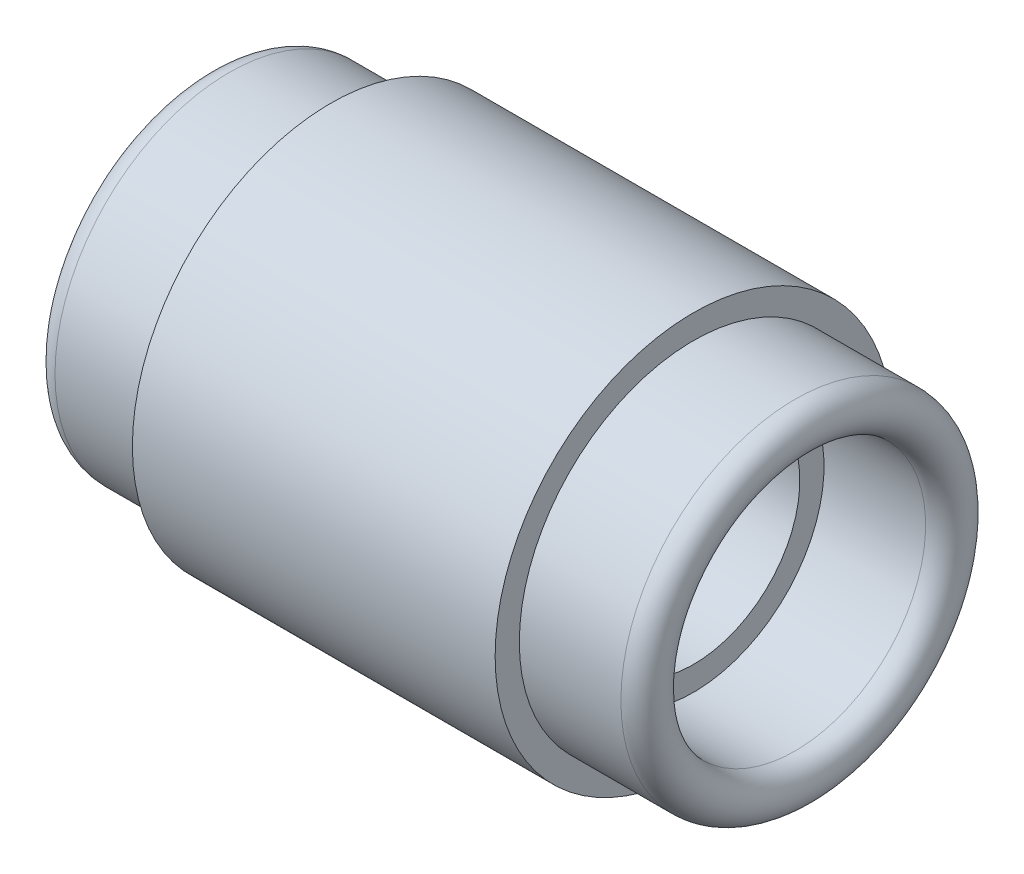
ISO-10303-21;
HEADER;
FILE_DESCRIPTION(('STEP AP214'),'2;1');
FILE_NAME('part.step','',(''),(''),'','','');
FILE_SCHEMA(('AUTOMOTIVE_DESIGN { 1 0 10303 214 1 1 1 1 }'));
ENDSEC;
DATA;
#1=APPLICATION_CONTEXT('core data for automotive mechanical design processes');
#2=APPLICATION_PROTOCOL_DEFINITION('international standard','automotive_design',2000,#1);
#3=PRODUCT_CONTEXT('',#1,'mechanical');
#4=PRODUCT('Part','Part','',(#3));
#5=PRODUCT_RELATED_PRODUCT_CATEGORY('part','',(#4));
#6=PRODUCT_DEFINITION_FORMATION('','',#4);
#7=PRODUCT_DEFINITION_CONTEXT('part definition',#1,'design');
#8=PRODUCT_DEFINITION('design','',#6,#7);
#9=PRODUCT_DEFINITION_SHAPE('','',#8);
#10=(LENGTH_UNIT() NAMED_UNIT(*) SI_UNIT(.MILLI.,.METRE.));
#11=(NAMED_UNIT(*) PLANE_ANGLE_UNIT() SI_UNIT($,.RADIAN.));
#12=(NAMED_UNIT(*) SI_UNIT($,.STERADIAN.) SOLID_ANGLE_UNIT());
#13=UNCERTAINTY_MEASURE_WITH_UNIT(LENGTH_MEASURE(1.E-05),#10,'distance_accuracy_value','');
#14=(GEOMETRIC_REPRESENTATION_CONTEXT(3) GLOBAL_UNCERTAINTY_ASSIGNED_CONTEXT((#13)) GLOBAL_UNIT_ASSIGNED_CONTEXT((#10,
#11,#12)) REPRESENTATION_CONTEXT('',''));
#15=CARTESIAN_POINT('',(0.,0.,0.));
#16=DIRECTION('',(0.,0.,1.));
#17=DIRECTION('',(1.,0.,0.));
#18=AXIS2_PLACEMENT_3D('',#15,#16,#17);
#19=CARTESIAN_POINT('',(-37.5,36.,0.));
#20=DIRECTION('',(1.,0.,0.));
#21=DIRECTION('',(0.,0.,-1.));
#22=AXIS2_PLACEMENT_3D('',#19,#20,#21);
#23=PLANE('',#22);
#24=CARTESIAN_POINT('',(-37.5,0.,0.));
#25=DIRECTION('',(-1.,0.,0.));
#26=DIRECTION('',(0.,0.,1.));
#27=AXIS2_PLACEMENT_3D('',#24,#25,#26);
#28=CIRCLE('',#27,36.);
#29=CARTESIAN_POINT('',(-37.5,0.,36.));
#30=VERTEX_POINT('',#29);
#31=EDGE_CURVE('E54',#30,#30,#28,.T.);
#32=ORIENTED_EDGE('',*,*,#31,.F.);
#33=EDGE_LOOP('',(#32));
#34=FACE_BOUND('',#33,.T.);
#35=CARTESIAN_POINT('',(-37.5,0.,0.));
#36=DIRECTION('',(-1.,0.,0.));
#37=DIRECTION('',(0.,0.,1.));
#38=AXIS2_PLACEMENT_3D('',#35,#36,#37);
#39=CIRCLE('',#38,41.);
#40=CARTESIAN_POINT('',(-37.5,0.,41.));
#41=VERTEX_POINT('',#40);
#42=EDGE_CURVE('E10',#41,#41,#39,.T.);
#43=ORIENTED_EDGE('',*,*,#42,.T.);
#44=EDGE_LOOP('',(#43));
#45=FACE_BOUND('',#44,.T.);
#46=ADVANCED_FACE('F14',(#34,#45),#23,.F.);
#47=CARTESIAN_POINT('',(-110.,0.,0.));
#48=DIRECTION('',(-1.,0.,0.));
#49=DIRECTION('',(0.,0.,1.));
#50=AXIS2_PLACEMENT_3D('',#47,#48,#49);
#51=CYLINDRICAL_SURFACE('',#50,41.);
#52=ORIENTED_EDGE('',*,*,#42,.F.);
#53=EDGE_LOOP('',(#52));
#54=FACE_BOUND('',#53,.T.);
#55=CARTESIAN_POINT('',(37.5,0.,0.));
#56=DIRECTION('',(-1.,0.,0.));
#57=DIRECTION('',(0.,0.,1.));
#58=AXIS2_PLACEMENT_3D('',#55,#56,#57);
#59=CIRCLE('',#58,41.);
#60=CARTESIAN_POINT('',(37.5,0.,41.));
#61=VERTEX_POINT('',#60);
#62=EDGE_CURVE('E20',#61,#61,#59,.T.);
#63=ORIENTED_EDGE('',*,*,#62,.T.);
#64=EDGE_LOOP('',(#63));
#65=FACE_BOUND('',#64,.T.);
#66=ADVANCED_FACE('F61',(#54,#65),#51,.T.);
#67=CARTESIAN_POINT('',(37.5,36.,0.));
#68=DIRECTION('',(-1.,0.,0.));
#69=DIRECTION('',(0.,0.,1.));
#70=AXIS2_PLACEMENT_3D('',#67,#68,#69);
#71=PLANE('',#70);
#72=ORIENTED_EDGE('',*,*,#62,.F.);
#73=EDGE_LOOP('',(#72));
#74=FACE_BOUND('',#73,.T.);
#75=CARTESIAN_POINT('',(37.5,0.,0.));
#76=DIRECTION('',(-1.,0.,0.));
#77=DIRECTION('',(0.,0.,1.));
#78=AXIS2_PLACEMENT_3D('',#75,#76,#77);
#79=CIRCLE('',#78,36.);
#80=CARTESIAN_POINT('',(37.5,0.,36.));
#81=VERTEX_POINT('',#80);
#82=EDGE_CURVE('E24',#81,#81,#79,.T.);
#83=ORIENTED_EDGE('',*,*,#82,.T.);
#84=EDGE_LOOP('',(#83));
#85=FACE_BOUND('',#84,.T.);
#86=ADVANCED_FACE('F66',(#74,#85),#71,.F.);
#87=CARTESIAN_POINT('',(-110.,0.,0.));
#88=DIRECTION('',(-1.,0.,0.));
#89=DIRECTION('',(0.,0.,1.));
#90=AXIS2_PLACEMENT_3D('',#87,#88,#89);
#91=CYLINDRICAL_SURFACE('',#90,36.);
#92=ORIENTED_EDGE('',*,*,#82,.F.);
#93=EDGE_LOOP('',(#92));
#94=FACE_BOUND('',#93,.T.);
#95=CARTESIAN_POINT('',(58.5,0.,0.));
#96=DIRECTION('',(-1.,0.,0.));
#97=DIRECTION('',(0.,0.,1.));
#98=AXIS2_PLACEMENT_3D('',#95,#96,#97);
#99=CIRCLE('',#98,36.);
#100=CARTESIAN_POINT('',(58.5,0.,36.));
#101=VERTEX_POINT('',#100);
#102=EDGE_CURVE('E28',#101,#101,#99,.T.);
#103=ORIENTED_EDGE('',*,*,#102,.T.);
#104=EDGE_LOOP('',(#103));
#105=FACE_BOUND('',#104,.T.);
#106=ADVANCED_FACE('F71',(#94,#105),#91,.T.);
#107=CARTESIAN_POINT('',(58.5,0.,0.));
#108=DIRECTION('',(-1.,0.,0.));
#109=DIRECTION('',(0.,0.,1.));
#110=AXIS2_PLACEMENT_3D('',#107,#108,#109);
#111=TOROIDAL_SURFACE('',#110,31.5,4.5);
#112=ORIENTED_EDGE('',*,*,#102,.F.);
#113=EDGE_LOOP('',(#112));
#114=FACE_BOUND('',#113,.T.);
#115=CARTESIAN_POINT('',(58.5,0.,0.));
#116=DIRECTION('',(-1.,0.,0.));
#117=DIRECTION('',(0.,0.,1.));
#118=AXIS2_PLACEMENT_3D('',#115,#116,#117);
#119=CIRCLE('',#118,27.);
#120=CARTESIAN_POINT('',(58.5,0.,27.));
#121=VERTEX_POINT('',#120);
#122=EDGE_CURVE('E33',#121,#121,#119,.T.);
#123=ORIENTED_EDGE('',*,*,#122,.T.);
#124=EDGE_LOOP('',(#123));
#125=FACE_BOUND('',#124,.T.);
#126=ADVANCED_FACE('F77',(#114,#125),#111,.T.);
#127=CARTESIAN_POINT('',(-110.,0.,0.));
#128=DIRECTION('',(-1.,0.,0.));
#129=DIRECTION('',(0.,0.,1.));
#130=AXIS2_PLACEMENT_3D('',#127,#128,#129);
#131=CYLINDRICAL_SURFACE('',#130,27.);
#132=ORIENTED_EDGE('',*,*,#122,.F.);
#133=EDGE_LOOP('',(#132));
#134=FACE_BOUND('',#133,.T.);
#135=CARTESIAN_POINT('',(37.5,0.,0.));
#136=DIRECTION('',(-1.,0.,0.));
#137=DIRECTION('',(0.,0.,1.));
#138=AXIS2_PLACEMENT_3D('',#135,#136,#137);
#139=CIRCLE('',#138,27.);
#140=CARTESIAN_POINT('',(37.5,0.,27.));
#141=VERTEX_POINT('',#140);
#142=EDGE_CURVE('E36',#141,#141,#139,.T.);
#143=ORIENTED_EDGE('',*,*,#142,.T.);
#144=EDGE_LOOP('',(#143));
#145=FACE_BOUND('',#144,.T.);
#146=ADVANCED_FACE('F81',(#134,#145),#131,.F.);
#147=CARTESIAN_POINT('',(37.5,27.,0.));
#148=DIRECTION('',(-1.,0.,0.));
#149=DIRECTION('',(0.,0.,1.));
#150=AXIS2_PLACEMENT_3D('',#147,#148,#149);
#151=PLANE('',#150);
#152=ORIENTED_EDGE('',*,*,#142,.F.);
#153=EDGE_LOOP('',(#152));
#154=FACE_BOUND('',#153,.T.);
#155=CARTESIAN_POINT('',(37.5,0.,0.));
#156=DIRECTION('',(-1.,0.,0.));
#157=DIRECTION('',(0.,0.,1.));
#158=AXIS2_PLACEMENT_3D('',#155,#156,#157);
#159=CIRCLE('',#158,22.);
#160=CARTESIAN_POINT('',(37.5,0.,22.));
#161=VERTEX_POINT('',#160);
#162=EDGE_CURVE('E39',#161,#161,#159,.T.);
#163=ORIENTED_EDGE('',*,*,#162,.T.);
#164=EDGE_LOOP('',(#163));
#165=FACE_BOUND('',#164,.T.);
#166=ADVANCED_FACE('F85',(#154,#165),#151,.F.);
#167=CARTESIAN_POINT('',(-110.,0.,0.));
#168=DIRECTION('',(-1.,0.,0.));
#169=DIRECTION('',(0.,0.,1.));
#170=AXIS2_PLACEMENT_3D('',#167,#168,#169);
#171=CYLINDRICAL_SURFACE('',#170,22.);
#172=ORIENTED_EDGE('',*,*,#162,.F.);
#173=EDGE_LOOP('',(#172));
#174=FACE_BOUND('',#173,.T.);
#175=CARTESIAN_POINT('',(-37.5,0.,0.));
#176=DIRECTION('',(-1.,0.,0.));
#177=DIRECTION('',(0.,0.,1.));
#178=AXIS2_PLACEMENT_3D('',#175,#176,#177);
#179=CIRCLE('',#178,22.);
#180=CARTESIAN_POINT('',(-37.5,0.,22.));
#181=VERTEX_POINT('',#180);
#182=EDGE_CURVE('E42',#181,#181,#179,.T.);
#183=ORIENTED_EDGE('',*,*,#182,.T.);
#184=EDGE_LOOP('',(#183));
#185=FACE_BOUND('',#184,.T.);
#186=ADVANCED_FACE('F89',(#174,#185),#171,.F.);
#187=CARTESIAN_POINT('',(-37.5,27.,0.));
#188=DIRECTION('',(1.,0.,0.));
#189=DIRECTION('',(0.,0.,-1.));
#190=AXIS2_PLACEMENT_3D('',#187,#188,#189);
#191=PLANE('',#190);
#192=ORIENTED_EDGE('',*,*,#182,.F.);
#193=EDGE_LOOP('',(#192));
#194=FACE_BOUND('',#193,.T.);
#195=CARTESIAN_POINT('',(-37.5,0.,0.));
#196=DIRECTION('',(-1.,0.,0.));
#197=DIRECTION('',(0.,0.,1.));
#198=AXIS2_PLACEMENT_3D('',#195,#196,#197);
#199=CIRCLE('',#198,27.);
#200=CARTESIAN_POINT('',(-37.5,0.,27.));
#201=VERTEX_POINT('',#200);
#202=EDGE_CURVE('E45',#201,#201,#199,.T.);
#203=ORIENTED_EDGE('',*,*,#202,.T.);
#204=EDGE_LOOP('',(#203));
#205=FACE_BOUND('',#204,.T.);
#206=ADVANCED_FACE('F93',(#194,#205),#191,.F.);
#207=CARTESIAN_POINT('',(-110.,0.,0.));
#208=DIRECTION('',(-1.,0.,0.));
#209=DIRECTION('',(0.,0.,1.));
#210=AXIS2_PLACEMENT_3D('',#207,#208,#209);
#211=CYLINDRICAL_SURFACE('',#210,27.);
#212=ORIENTED_EDGE('',*,*,#202,.F.);
#213=EDGE_LOOP('',(#212));
#214=FACE_BOUND('',#213,.T.);
#215=CARTESIAN_POINT('',(-58.5,0.,0.));
#216=DIRECTION('',(-1.,0.,0.));
#217=DIRECTION('',(0.,0.,1.));
#218=AXIS2_PLACEMENT_3D('',#215,#216,#217);
#219=CIRCLE('',#218,27.);
#220=CARTESIAN_POINT('',(-58.5,0.,27.));
#221=VERTEX_POINT('',#220);
#222=EDGE_CURVE('E48',#221,#221,#219,.T.);
#223=ORIENTED_EDGE('',*,*,#222,.T.);
#224=EDGE_LOOP('',(#223));
#225=FACE_BOUND('',#224,.T.);
#226=ADVANCED_FACE('F97',(#214,#225),#211,.F.);
#227=CARTESIAN_POINT('',(-58.5,0.,0.));
#228=DIRECTION('',(-1.,0.,0.));
#229=DIRECTION('',(0.,0.,1.));
#230=AXIS2_PLACEMENT_3D('',#227,#228,#229);
#231=TOROIDAL_SURFACE('',#230,31.5,4.5);
#232=ORIENTED_EDGE('',*,*,#222,.F.);
#233=EDGE_LOOP('',(#232));
#234=FACE_BOUND('',#233,.T.);
#235=CARTESIAN_POINT('',(-58.5,0.,0.));
#236=DIRECTION('',(-1.,0.,0.));
#237=DIRECTION('',(0.,0.,1.));
#238=AXIS2_PLACEMENT_3D('',#235,#236,#237);
#239=CIRCLE('',#238,36.);
#240=CARTESIAN_POINT('',(-58.5,0.,36.));
#241=VERTEX_POINT('',#240);
#242=EDGE_CURVE('E51',#241,#241,#239,.T.);
#243=ORIENTED_EDGE('',*,*,#242,.T.);
#244=EDGE_LOOP('',(#243));
#245=FACE_BOUND('',#244,.T.);
#246=ADVANCED_FACE('F101',(#234,#245),#231,.T.);
#247=CARTESIAN_POINT('',(-110.,0.,0.));
#248=DIRECTION('',(-1.,0.,0.));
#249=DIRECTION('',(0.,0.,1.));
#250=AXIS2_PLACEMENT_3D('',#247,#248,#249);
#251=CYLINDRICAL_SURFACE('',#250,36.);
#252=ORIENTED_EDGE('',*,*,#242,.F.);
#253=EDGE_LOOP('',(#252));
#254=FACE_BOUND('',#253,.T.);
#255=ORIENTED_EDGE('',*,*,#31,.T.);
#256=EDGE_LOOP('',(#255));
#257=FACE_BOUND('',#256,.T.);
#258=ADVANCED_FACE('F58',(#254,#257),#251,.T.);
#259=CLOSED_SHELL('',(#46,#66,#86,#106,#126,#146,#166,#186,#206,#226,#246,#258));
#260=MANIFOLD_SOLID_BREP('B1',#259);
#261=ADVANCED_BREP_SHAPE_REPRESENTATION('',(#18,#260),#14);
#262=SHAPE_DEFINITION_REPRESENTATION(#9,#261);
ENDSEC;
END-ISO-10303-21;
